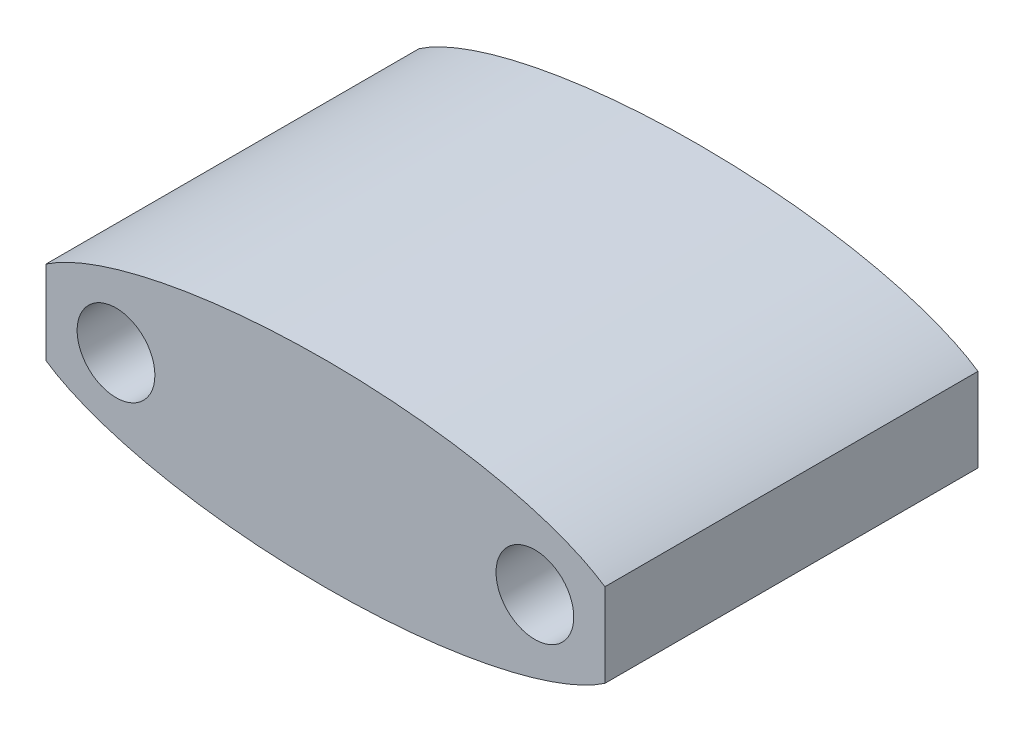
ISO-10303-21;
HEADER;
FILE_DESCRIPTION(('STEP AP214'),'2;1');
FILE_NAME('part.step','',(''),(''),'','','');
FILE_SCHEMA(('AUTOMOTIVE_DESIGN { 1 0 10303 214 1 1 1 1 }'));
ENDSEC;
DATA;
#1=APPLICATION_CONTEXT('core data for automotive mechanical design processes');
#2=APPLICATION_PROTOCOL_DEFINITION('international standard','automotive_design',2000,#1);
#3=PRODUCT_CONTEXT('',#1,'mechanical');
#4=PRODUCT('Part','Part','',(#3));
#5=PRODUCT_RELATED_PRODUCT_CATEGORY('part','',(#4));
#6=PRODUCT_DEFINITION_FORMATION('','',#4);
#7=PRODUCT_DEFINITION_CONTEXT('part definition',#1,'design');
#8=PRODUCT_DEFINITION('design','',#6,#7);
#9=PRODUCT_DEFINITION_SHAPE('','',#8);
#10=(LENGTH_UNIT() NAMED_UNIT(*) SI_UNIT(.MILLI.,.METRE.));
#11=(NAMED_UNIT(*) PLANE_ANGLE_UNIT() SI_UNIT($,.RADIAN.));
#12=(NAMED_UNIT(*) SI_UNIT($,.STERADIAN.) SOLID_ANGLE_UNIT());
#13=UNCERTAINTY_MEASURE_WITH_UNIT(LENGTH_MEASURE(1.E-05),#10,'distance_accuracy_value','');
#14=(GEOMETRIC_REPRESENTATION_CONTEXT(3) GLOBAL_UNCERTAINTY_ASSIGNED_CONTEXT((#13)) GLOBAL_UNIT_ASSIGNED_CONTEXT((#10,
#11,#12)) REPRESENTATION_CONTEXT('',''));
#15=CARTESIAN_POINT('',(0.,0.,0.));
#16=DIRECTION('',(0.,0.,1.));
#17=DIRECTION('',(1.,0.,0.));
#18=AXIS2_PLACEMENT_3D('',#15,#16,#17);
#19=CARTESIAN_POINT('',(0.,0.,120.));
#20=DIRECTION('',(0.,0.,1.));
#21=DIRECTION('',(-1.,0.,0.));
#22=AXIS2_PLACEMENT_3D('',#19,#20,#21);
#23=ELLIPSE('',#22,99.2732195369688,31.6948253655301);
#24=DIRECTION('',(0.,0.,-1.));
#25=VECTOR('',#24,1.);
#26=SURFACE_OF_LINEAR_EXTRUSION('',#23,#25);
#27=CARTESIAN_POINT('',(0.,0.,0.));
#28=DIRECTION('',(0.,0.,1.));
#29=DIRECTION('',(-1.,0.,0.));
#30=AXIS2_PLACEMENT_3D('',#27,#28,#29);
#31=ELLIPSE('',#30,99.2732195369688,31.6948253655301);
#32=CARTESIAN_POINT('',(-89.8766172252199,-13.4599877697962,0.));
#33=VERTEX_POINT('',#32);
#34=CARTESIAN_POINT('',(89.8766172252199,-13.4599877697962,0.));
#35=VERTEX_POINT('',#34);
#36=EDGE_CURVE('E116',#33,#35,#31,.T.);
#37=ORIENTED_EDGE('',*,*,#36,.T.);
#38=DIRECTION('',(0.,0.,-1.));
#39=VECTOR('',#38,1.);
#40=CARTESIAN_POINT('',(89.8766172252199,-13.4599877697962,120.));
#41=LINE('',#40,#39);
#42=CARTESIAN_POINT('',(89.8766172252199,-13.4599877697962,120.));
#43=VERTEX_POINT('',#42);
#44=EDGE_CURVE('E11',#43,#35,#41,.T.);
#45=ORIENTED_EDGE('',*,*,#44,.F.);
#46=CARTESIAN_POINT('',(-89.8766172252199,-13.4599877697962,120.));
#47=VERTEX_POINT('',#46);
#48=EDGE_CURVE('E90',#47,#43,#23,.T.);
#49=ORIENTED_EDGE('',*,*,#48,.F.);
#50=DIRECTION('',(0.,0.,-1.));
#51=VECTOR('',#50,1.);
#52=CARTESIAN_POINT('',(-89.8766172252199,-13.4599877697962,120.));
#53=LINE('',#52,#51);
#54=EDGE_CURVE('E98',#47,#33,#53,.T.);
#55=ORIENTED_EDGE('',*,*,#54,.T.);
#56=EDGE_LOOP('',(#37,#45,#49,#55));
#57=FACE_BOUND('',#56,.T.);
#58=ADVANCED_FACE('F38',(#57),#26,.F.);
#59=CARTESIAN_POINT('',(89.8766172252199,-13.4599877697962,120.));
#60=DIRECTION('',(-1.,0.,0.));
#61=DIRECTION('',(0.,-1.,0.));
#62=AXIS2_PLACEMENT_3D('',#59,#60,#61);
#63=PLANE('',#62);
#64=DIRECTION('',(0.,1.,0.));
#65=VECTOR('',#64,1.);
#66=CARTESIAN_POINT('',(89.8766172252199,-13.4599877697962,0.));
#67=LINE('',#66,#65);
#68=CARTESIAN_POINT('',(89.8766172252199,13.4599877697961,0.));
#69=VERTEX_POINT('',#68);
#70=EDGE_CURVE('E94',#35,#69,#67,.T.);
#71=ORIENTED_EDGE('',*,*,#70,.T.);
#72=DIRECTION('',(0.,0.,-1.));
#73=VECTOR('',#72,1.);
#74=CARTESIAN_POINT('',(89.8766172252199,13.4599877697961,120.));
#75=LINE('',#74,#73);
#76=CARTESIAN_POINT('',(89.8766172252199,13.4599877697961,120.));
#77=VERTEX_POINT('',#76);
#78=EDGE_CURVE('E47',#77,#69,#75,.T.);
#79=ORIENTED_EDGE('',*,*,#78,.F.);
#80=DIRECTION('',(0.,1.,0.));
#81=VECTOR('',#80,1.);
#82=CARTESIAN_POINT('',(89.8766172252199,-13.4599877697962,120.));
#83=LINE('',#82,#81);
#84=EDGE_CURVE('E85',#43,#77,#83,.T.);
#85=ORIENTED_EDGE('',*,*,#84,.F.);
#86=ORIENTED_EDGE('',*,*,#44,.T.);
#87=EDGE_LOOP('',(#71,#79,#85,#86));
#88=FACE_BOUND('',#87,.T.);
#89=ADVANCED_FACE('F93',(#88),#63,.F.);
#90=CARTESIAN_POINT('',(0.,0.,120.));
#91=DIRECTION('',(0.,0.,1.));
#92=DIRECTION('',(-1.,0.,0.));
#93=AXIS2_PLACEMENT_3D('',#90,#91,#92);
#94=ELLIPSE('',#93,99.2732195369688,31.6948253655301);
#95=DIRECTION('',(0.,0.,-1.));
#96=VECTOR('',#95,1.);
#97=SURFACE_OF_LINEAR_EXTRUSION('',#94,#96);
#98=CARTESIAN_POINT('',(0.,0.,0.));
#99=DIRECTION('',(0.,0.,1.));
#100=DIRECTION('',(-1.,0.,0.));
#101=AXIS2_PLACEMENT_3D('',#98,#99,#100);
#102=ELLIPSE('',#101,99.2732195369688,31.6948253655301);
#103=CARTESIAN_POINT('',(-89.8766172252199,13.4599877697961,0.));
#104=VERTEX_POINT('',#103);
#105=EDGE_CURVE('E72',#69,#104,#102,.T.);
#106=ORIENTED_EDGE('',*,*,#105,.T.);
#107=DIRECTION('',(0.,0.,-1.));
#108=VECTOR('',#107,1.);
#109=CARTESIAN_POINT('',(-89.8766172252199,13.4599877697961,120.));
#110=LINE('',#109,#108);
#111=CARTESIAN_POINT('',(-89.8766172252199,13.4599877697961,120.));
#112=VERTEX_POINT('',#111);
#113=EDGE_CURVE('E95',#112,#104,#110,.T.);
#114=ORIENTED_EDGE('',*,*,#113,.F.);
#115=EDGE_CURVE('E88',#77,#112,#94,.T.);
#116=ORIENTED_EDGE('',*,*,#115,.F.);
#117=ORIENTED_EDGE('',*,*,#78,.T.);
#118=EDGE_LOOP('',(#106,#114,#116,#117));
#119=FACE_BOUND('',#118,.T.);
#120=ADVANCED_FACE('F96',(#119),#97,.F.);
#121=CARTESIAN_POINT('',(-89.8766172252199,-13.4599877697962,120.));
#122=DIRECTION('',(1.,0.,0.));
#123=DIRECTION('',(0.,1.,0.));
#124=AXIS2_PLACEMENT_3D('',#121,#122,#123);
#125=PLANE('',#124);
#126=DIRECTION('',(0.,-1.,0.));
#127=VECTOR('',#126,1.);
#128=CARTESIAN_POINT('',(-89.8766172252199,-13.4599877697962,0.));
#129=LINE('',#128,#127);
#130=EDGE_CURVE('E78',#104,#33,#129,.T.);
#131=ORIENTED_EDGE('',*,*,#130,.T.);
#132=ORIENTED_EDGE('',*,*,#54,.F.);
#133=DIRECTION('',(0.,-1.,0.));
#134=VECTOR('',#133,1.);
#135=CARTESIAN_POINT('',(-89.8766172252199,-13.4599877697962,120.));
#136=LINE('',#135,#134);
#137=EDGE_CURVE('E55',#112,#47,#136,.T.);
#138=ORIENTED_EDGE('',*,*,#137,.F.);
#139=ORIENTED_EDGE('',*,*,#113,.T.);
#140=EDGE_LOOP('',(#131,#132,#138,#139));
#141=FACE_BOUND('',#140,.T.);
#142=ADVANCED_FACE('F105',(#141),#125,.F.);
#143=CARTESIAN_POINT('',(0.,0.,120.));
#144=DIRECTION('',(0.,0.,1.));
#145=DIRECTION('',(1.,0.,0.));
#146=AXIS2_PLACEMENT_3D('',#143,#144,#145);
#147=PLANE('',#146);
#148=CARTESIAN_POINT('',(-67.3583644947716,0.,120.));
#149=DIRECTION('',(0.,0.,1.));
#150=DIRECTION('',(1.,0.,0.));
#151=AXIS2_PLACEMENT_3D('',#148,#149,#150);
#152=CIRCLE('',#151,12.5);
#153=CARTESIAN_POINT('',(-54.8583644947716,0.,120.));
#154=VERTEX_POINT('',#153);
#155=EDGE_CURVE('E121',#154,#154,#152,.T.);
#156=ORIENTED_EDGE('',*,*,#155,.F.);
#157=EDGE_LOOP('',(#156));
#158=FACE_BOUND('',#157,.T.);
#159=CARTESIAN_POINT('',(67.3583644947716,0.,120.));
#160=DIRECTION('',(0.,0.,1.));
#161=DIRECTION('',(-1.,0.,0.));
#162=AXIS2_PLACEMENT_3D('',#159,#160,#161);
#163=CIRCLE('',#162,12.5);
#164=CARTESIAN_POINT('',(54.8583644947716,0.,120.));
#165=VERTEX_POINT('',#164);
#166=EDGE_CURVE('E156',#165,#165,#163,.T.);
#167=ORIENTED_EDGE('',*,*,#166,.F.);
#168=EDGE_LOOP('',(#167));
#169=FACE_BOUND('',#168,.T.);
#170=ORIENTED_EDGE('',*,*,#48,.T.);
#171=ORIENTED_EDGE('',*,*,#84,.T.);
#172=ORIENTED_EDGE('',*,*,#115,.T.);
#173=ORIENTED_EDGE('',*,*,#137,.T.);
#174=EDGE_LOOP('',(#170,#171,#172,#173));
#175=FACE_BOUND('',#174,.T.);
#176=ADVANCED_FACE('F86',(#158,#169,#175),#147,.T.);
#177=CARTESIAN_POINT('',(0.,0.,0.));
#178=DIRECTION('',(0.,0.,1.));
#179=DIRECTION('',(1.,0.,0.));
#180=AXIS2_PLACEMENT_3D('',#177,#178,#179);
#181=PLANE('',#180);
#182=ORIENTED_EDGE('',*,*,#36,.F.);
#183=ORIENTED_EDGE('',*,*,#130,.F.);
#184=ORIENTED_EDGE('',*,*,#105,.F.);
#185=ORIENTED_EDGE('',*,*,#70,.F.);
#186=EDGE_LOOP('',(#182,#183,#184,#185));
#187=FACE_BOUND('',#186,.T.);
#188=ADVANCED_FACE('F127',(#187),#181,.F.);
#189=CARTESIAN_POINT('',(67.3583644947716,0.,40.));
#190=DIRECTION('',(0.,0.,1.));
#191=DIRECTION('',(1.,0.,0.));
#192=AXIS2_PLACEMENT_3D('',#189,#190,#191);
#193=CYLINDRICAL_SURFACE('',#192,12.5);
#194=CARTESIAN_POINT('',(67.3583644947716,0.,40.));
#195=DIRECTION('',(0.,0.,1.));
#196=DIRECTION('',(-1.,0.,0.));
#197=AXIS2_PLACEMENT_3D('',#194,#195,#196);
#198=CIRCLE('',#197,12.5);
#199=CARTESIAN_POINT('',(54.8583644947716,0.,40.));
#200=VERTEX_POINT('',#199);
#201=EDGE_CURVE('E159',#200,#200,#198,.T.);
#202=ORIENTED_EDGE('',*,*,#201,.F.);
#203=EDGE_LOOP('',(#202));
#204=FACE_BOUND('',#203,.T.);
#205=ORIENTED_EDGE('',*,*,#166,.T.);
#206=EDGE_LOOP('',(#205));
#207=FACE_BOUND('',#206,.T.);
#208=ADVANCED_FACE('F129',(#204,#207),#193,.F.);
#209=CARTESIAN_POINT('',(67.3583644947716,0.,40.));
#210=DIRECTION('',(0.,0.,-1.));
#211=DIRECTION('',(-1.,0.,0.));
#212=AXIS2_PLACEMENT_3D('',#209,#210,#211);
#213=PLANE('',#212);
#214=ORIENTED_EDGE('',*,*,#201,.T.);
#215=EDGE_LOOP('',(#214));
#216=FACE_BOUND('',#215,.T.);
#217=ADVANCED_FACE('F134',(#216),#213,.F.);
#218=CARTESIAN_POINT('',(-67.3583644947716,0.,40.));
#219=DIRECTION('',(0.,0.,1.));
#220=DIRECTION('',(1.,0.,0.));
#221=AXIS2_PLACEMENT_3D('',#218,#219,#220);
#222=CYLINDRICAL_SURFACE('',#221,12.5);
#223=CARTESIAN_POINT('',(-67.3583644947716,0.,40.));
#224=DIRECTION('',(0.,0.,1.));
#225=DIRECTION('',(1.,0.,0.));
#226=AXIS2_PLACEMENT_3D('',#223,#224,#225);
#227=CIRCLE('',#226,12.5);
#228=CARTESIAN_POINT('',(-54.8583644947716,0.,40.));
#229=VERTEX_POINT('',#228);
#230=EDGE_CURVE('E118',#229,#229,#227,.T.);
#231=ORIENTED_EDGE('',*,*,#230,.F.);
#232=EDGE_LOOP('',(#231));
#233=FACE_BOUND('',#232,.T.);
#234=ORIENTED_EDGE('',*,*,#155,.T.);
#235=EDGE_LOOP('',(#234));
#236=FACE_BOUND('',#235,.T.);
#237=ADVANCED_FACE('F141',(#233,#236),#222,.F.);
#238=CARTESIAN_POINT('',(-67.3583644947716,0.,40.));
#239=DIRECTION('',(0.,0.,1.));
#240=DIRECTION('',(1.,0.,0.));
#241=AXIS2_PLACEMENT_3D('',#238,#239,#240);
#242=PLANE('',#241);
#243=ORIENTED_EDGE('',*,*,#230,.T.);
#244=EDGE_LOOP('',(#243));
#245=FACE_BOUND('',#244,.T.);
#246=ADVANCED_FACE('F146',(#245),#242,.T.);
#247=CLOSED_SHELL('',(#58,#89,#120,#142,#176,#188,#208,#217,#237,#246));
#248=MANIFOLD_SOLID_BREP('B2',#247);
#249=ADVANCED_BREP_SHAPE_REPRESENTATION('',(#18,#248),#14);
#250=SHAPE_DEFINITION_REPRESENTATION(#9,#249);
ENDSEC;
END-ISO-10303-21;
